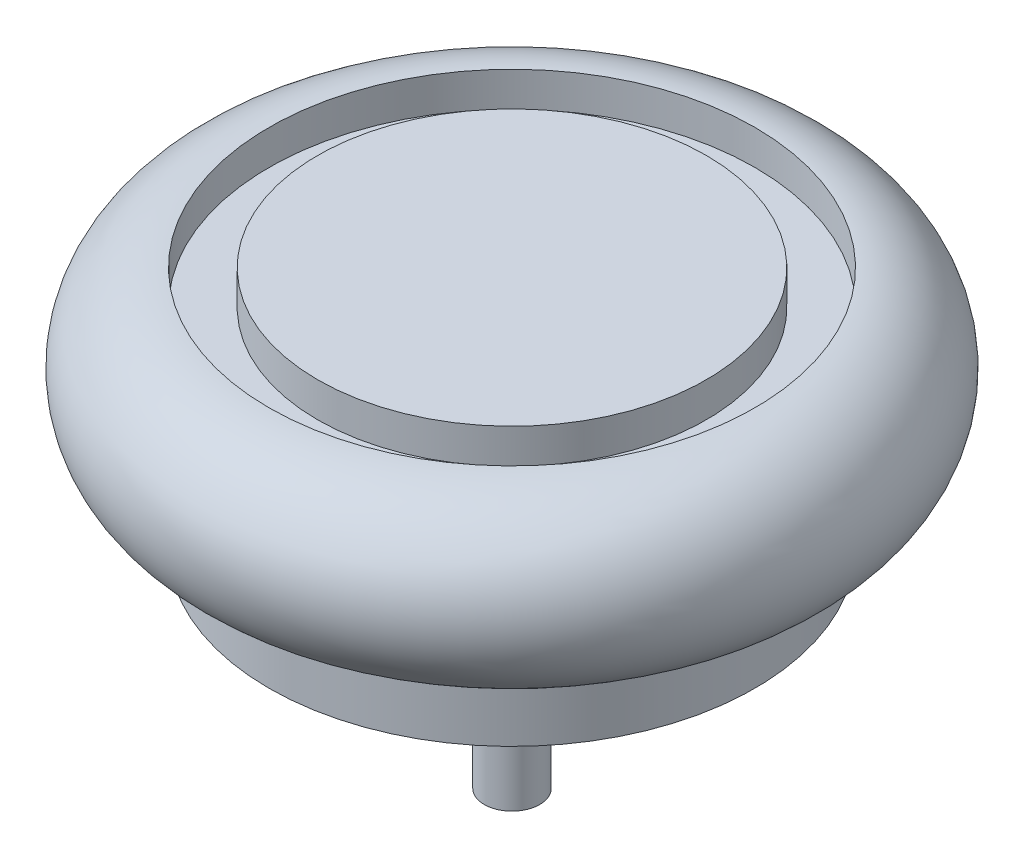
ISO-10303-21;
HEADER;
FILE_DESCRIPTION(('STEP AP214'),'2;1');
FILE_NAME('part.step','',(''),(''),'','','');
FILE_SCHEMA(('AUTOMOTIVE_DESIGN { 1 0 10303 214 1 1 1 1 }'));
ENDSEC;
DATA;
#1=APPLICATION_CONTEXT('core data for automotive mechanical design processes');
#2=APPLICATION_PROTOCOL_DEFINITION('international standard','automotive_design',2000,#1);
#3=PRODUCT_CONTEXT('',#1,'mechanical');
#4=PRODUCT('Part','Part','',(#3));
#5=PRODUCT_RELATED_PRODUCT_CATEGORY('part','',(#4));
#6=PRODUCT_DEFINITION_FORMATION('','',#4);
#7=PRODUCT_DEFINITION_CONTEXT('part definition',#1,'design');
#8=PRODUCT_DEFINITION('design','',#6,#7);
#9=PRODUCT_DEFINITION_SHAPE('','',#8);
#10=(LENGTH_UNIT() NAMED_UNIT(*) SI_UNIT(.MILLI.,.METRE.));
#11=(NAMED_UNIT(*) PLANE_ANGLE_UNIT() SI_UNIT($,.RADIAN.));
#12=(NAMED_UNIT(*) SI_UNIT($,.STERADIAN.) SOLID_ANGLE_UNIT());
#13=UNCERTAINTY_MEASURE_WITH_UNIT(LENGTH_MEASURE(1.E-05),#10,'distance_accuracy_value','');
#14=(GEOMETRIC_REPRESENTATION_CONTEXT(3) GLOBAL_UNCERTAINTY_ASSIGNED_CONTEXT((#13)) GLOBAL_UNIT_ASSIGNED_CONTEXT((#10,
#11,#12)) REPRESENTATION_CONTEXT('',''));
#15=CARTESIAN_POINT('',(0.,0.,0.));
#16=DIRECTION('',(0.,0.,1.));
#17=DIRECTION('',(1.,0.,0.));
#18=AXIS2_PLACEMENT_3D('',#15,#16,#17);
#19=CARTESIAN_POINT('',(0.,50.,56.));
#20=DIRECTION('',(0.,1.,0.));
#21=DIRECTION('',(0.,0.,1.));
#22=AXIS2_PLACEMENT_3D('',#19,#20,#21);
#23=PLANE('',#22);
#24=CARTESIAN_POINT('',(0.,50.,0.));
#25=DIRECTION('',(0.,1.,0.));
#26=DIRECTION('',(0.,0.,1.));
#27=AXIS2_PLACEMENT_3D('',#24,#25,#26);
#28=CIRCLE('',#27,56.);
#29=CARTESIAN_POINT('',(0.,50.,56.));
#30=VERTEX_POINT('',#29);
#31=EDGE_CURVE('E43',#30,#30,#28,.T.);
#32=ORIENTED_EDGE('',*,*,#31,.T.);
#33=EDGE_LOOP('',(#32));
#34=FACE_BOUND('',#33,.T.);
#35=ADVANCED_FACE('F40',(#34),#23,.T.);
#36=CARTESIAN_POINT('',(0.,50.,0.));
#37=DIRECTION('',(0.,1.,0.));
#38=DIRECTION('',(0.,0.,1.));
#39=AXIS2_PLACEMENT_3D('',#36,#37,#38);
#40=CYLINDRICAL_SURFACE('',#39,56.);
#41=CARTESIAN_POINT('',(0.,40.,0.));
#42=DIRECTION('',(0.,1.,0.));
#43=DIRECTION('',(0.,0.,1.));
#44=AXIS2_PLACEMENT_3D('',#41,#42,#43);
#45=CIRCLE('',#44,56.);
#46=CARTESIAN_POINT('',(0.,40.,56.));
#47=VERTEX_POINT('',#46);
#48=EDGE_CURVE('E50',#47,#47,#45,.T.);
#49=ORIENTED_EDGE('',*,*,#48,.T.);
#50=EDGE_LOOP('',(#49));
#51=FACE_BOUND('',#50,.T.);
#52=ORIENTED_EDGE('',*,*,#31,.F.);
#53=EDGE_LOOP('',(#52));
#54=FACE_BOUND('',#53,.T.);
#55=ADVANCED_FACE('F100',(#51,#54),#40,.T.);
#56=CARTESIAN_POINT('',(0.,40.,70.));
#57=DIRECTION('',(0.,1.,0.));
#58=DIRECTION('',(0.,0.,1.));
#59=AXIS2_PLACEMENT_3D('',#56,#57,#58);
#60=PLANE('',#59);
#61=CARTESIAN_POINT('',(0.,40.,0.));
#62=DIRECTION('',(0.,1.,0.));
#63=DIRECTION('',(0.,0.,1.));
#64=AXIS2_PLACEMENT_3D('',#61,#62,#63);
#65=CIRCLE('',#64,70.);
#66=CARTESIAN_POINT('',(0.,40.,70.));
#67=VERTEX_POINT('',#66);
#68=EDGE_CURVE('E51',#67,#67,#65,.T.);
#69=ORIENTED_EDGE('',*,*,#68,.T.);
#70=EDGE_LOOP('',(#69));
#71=FACE_BOUND('',#70,.T.);
#72=ORIENTED_EDGE('',*,*,#48,.F.);
#73=EDGE_LOOP('',(#72));
#74=FACE_BOUND('',#73,.T.);
#75=ADVANCED_FACE('F101',(#71,#74),#60,.T.);
#76=CARTESIAN_POINT('',(0.,50.,0.));
#77=DIRECTION('',(0.,1.,0.));
#78=DIRECTION('',(0.,0.,1.));
#79=AXIS2_PLACEMENT_3D('',#76,#77,#78);
#80=CYLINDRICAL_SURFACE('',#79,70.);
#81=CARTESIAN_POINT('',(0.,50.,0.));
#82=DIRECTION('',(0.,1.,0.));
#83=DIRECTION('',(0.,0.,1.));
#84=AXIS2_PLACEMENT_3D('',#81,#82,#83);
#85=CIRCLE('',#84,70.);
#86=CARTESIAN_POINT('',(0.,50.,70.));
#87=VERTEX_POINT('',#86);
#88=EDGE_CURVE('E57',#87,#87,#85,.T.);
#89=ORIENTED_EDGE('',*,*,#88,.T.);
#90=EDGE_LOOP('',(#89));
#91=FACE_BOUND('',#90,.T.);
#92=ORIENTED_EDGE('',*,*,#68,.F.);
#93=EDGE_LOOP('',(#92));
#94=FACE_BOUND('',#93,.T.);
#95=ADVANCED_FACE('F106',(#91,#94),#80,.F.);
#96=CARTESIAN_POINT('',(0.,25.,0.));
#97=DIRECTION('',(0.,1.,0.));
#98=DIRECTION('',(0.,0.,1.));
#99=AXIS2_PLACEMENT_3D('',#96,#97,#98);
#100=TOROIDAL_SURFACE('',#99,70.,25.);
#101=CARTESIAN_POINT('',(0.,0.,0.));
#102=DIRECTION('',(0.,-1.,0.));
#103=DIRECTION('',(0.,0.,-1.));
#104=AXIS2_PLACEMENT_3D('',#101,#102,#103);
#105=CIRCLE('',#104,70.);
#106=CARTESIAN_POINT('',(0.,0.,-70.));
#107=VERTEX_POINT('',#106);
#108=EDGE_CURVE('E58',#107,#107,#105,.T.);
#109=ORIENTED_EDGE('',*,*,#108,.F.);
#110=EDGE_LOOP('',(#109));
#111=FACE_BOUND('',#110,.T.);
#112=ORIENTED_EDGE('',*,*,#88,.F.);
#113=EDGE_LOOP('',(#112));
#114=FACE_BOUND('',#113,.T.);
#115=ADVANCED_FACE('F115',(#111,#114),#100,.T.);
#116=CARTESIAN_POINT('',(0.,-20.,0.));
#117=DIRECTION('',(0.,-1.,0.));
#118=DIRECTION('',(0.,0.,-1.));
#119=AXIS2_PLACEMENT_3D('',#116,#117,#118);
#120=PLANE('',#119);
#121=CARTESIAN_POINT('',(0.,-20.,0.));
#122=DIRECTION('',(0.,-1.,0.));
#123=DIRECTION('',(0.,0.,-1.));
#124=AXIS2_PLACEMENT_3D('',#121,#122,#123);
#125=CIRCLE('',#124,70.);
#126=CARTESIAN_POINT('',(0.,-20.,-70.));
#127=VERTEX_POINT('',#126);
#128=EDGE_CURVE('E56',#127,#127,#125,.T.);
#129=ORIENTED_EDGE('',*,*,#128,.T.);
#130=EDGE_LOOP('',(#129));
#131=FACE_BOUND('',#130,.T.);
#132=CARTESIAN_POINT('',(0.,-20.,0.));
#133=DIRECTION('',(0.,-1.,0.));
#134=DIRECTION('',(0.,0.,-1.));
#135=AXIS2_PLACEMENT_3D('',#132,#133,#134);
#136=CIRCLE('',#135,40.);
#137=CARTESIAN_POINT('',(0.,-20.,-40.));
#138=VERTEX_POINT('',#137);
#139=EDGE_CURVE('E62',#138,#138,#136,.T.);
#140=ORIENTED_EDGE('',*,*,#139,.F.);
#141=EDGE_LOOP('',(#140));
#142=FACE_BOUND('',#141,.T.);
#143=ADVANCED_FACE('F113',(#131,#142),#120,.T.);
#144=CARTESIAN_POINT('',(0.,-20.,0.));
#145=DIRECTION('',(0.,1.,0.));
#146=DIRECTION('',(0.,0.,1.));
#147=AXIS2_PLACEMENT_3D('',#144,#145,#146);
#148=CYLINDRICAL_SURFACE('',#147,70.);
#149=ORIENTED_EDGE('',*,*,#128,.F.);
#150=EDGE_LOOP('',(#149));
#151=FACE_BOUND('',#150,.T.);
#152=ORIENTED_EDGE('',*,*,#108,.T.);
#153=EDGE_LOOP('',(#152));
#154=FACE_BOUND('',#153,.T.);
#155=ADVANCED_FACE('F93',(#151,#154),#148,.T.);
#156=CARTESIAN_POINT('',(0.,-20.,0.));
#157=DIRECTION('',(0.,1.,0.));
#158=DIRECTION('',(0.,0.,1.));
#159=AXIS2_PLACEMENT_3D('',#156,#157,#158);
#160=CYLINDRICAL_SURFACE('',#159,40.);
#161=ORIENTED_EDGE('',*,*,#139,.T.);
#162=EDGE_LOOP('',(#161));
#163=FACE_BOUND('',#162,.T.);
#164=CARTESIAN_POINT('',(0.,0.,0.));
#165=DIRECTION('',(0.,-1.,0.));
#166=DIRECTION('',(0.,0.,-1.));
#167=AXIS2_PLACEMENT_3D('',#164,#165,#166);
#168=CIRCLE('',#167,40.);
#169=CARTESIAN_POINT('',(0.,0.,-40.));
#170=VERTEX_POINT('',#169);
#171=EDGE_CURVE('E10',#170,#170,#168,.F.);
#172=ORIENTED_EDGE('',*,*,#171,.T.);
#173=EDGE_LOOP('',(#172));
#174=FACE_BOUND('',#173,.T.);
#175=ADVANCED_FACE('F88',(#163,#174),#160,.F.);
#176=CARTESIAN_POINT('',(0.,0.,0.));
#177=DIRECTION('',(0.,-1.,0.));
#178=DIRECTION('',(0.,0.,-1.));
#179=AXIS2_PLACEMENT_3D('',#176,#177,#178);
#180=PLANE('',#179);
#181=CARTESIAN_POINT('',(0.,0.,0.));
#182=DIRECTION('',(0.,-1.,0.));
#183=DIRECTION('',(0.,0.,-1.));
#184=AXIS2_PLACEMENT_3D('',#181,#182,#183);
#185=CIRCLE('',#184,8.);
#186=CARTESIAN_POINT('',(0.,0.,-8.));
#187=VERTEX_POINT('',#186);
#188=EDGE_CURVE('E68',#187,#187,#185,.T.);
#189=ORIENTED_EDGE('',*,*,#188,.F.);
#190=EDGE_LOOP('',(#189));
#191=FACE_BOUND('',#190,.T.);
#192=ORIENTED_EDGE('',*,*,#171,.F.);
#193=EDGE_LOOP('',(#192));
#194=FACE_BOUND('',#193,.T.);
#195=ADVANCED_FACE('F79',(#191,#194),#180,.T.);
#196=CARTESIAN_POINT('',(0.,-80.,0.));
#197=DIRECTION('',(0.,1.,0.));
#198=DIRECTION('',(0.,0.,1.));
#199=AXIS2_PLACEMENT_3D('',#196,#197,#198);
#200=CYLINDRICAL_SURFACE('',#199,8.);
#201=CARTESIAN_POINT('',(0.,-80.,0.));
#202=DIRECTION('',(0.,-1.,0.));
#203=DIRECTION('',(0.,0.,-1.));
#204=AXIS2_PLACEMENT_3D('',#201,#202,#203);
#205=CIRCLE('',#204,8.);
#206=CARTESIAN_POINT('',(0.,-80.,-8.));
#207=VERTEX_POINT('',#206);
#208=EDGE_CURVE('E70',#207,#207,#205,.T.);
#209=ORIENTED_EDGE('',*,*,#208,.F.);
#210=EDGE_LOOP('',(#209));
#211=FACE_BOUND('',#210,.T.);
#212=ORIENTED_EDGE('',*,*,#188,.T.);
#213=EDGE_LOOP('',(#212));
#214=FACE_BOUND('',#213,.T.);
#215=ADVANCED_FACE('F80',(#211,#214),#200,.T.);
#216=CARTESIAN_POINT('',(0.,-80.,0.));
#217=DIRECTION('',(0.,-1.,0.));
#218=DIRECTION('',(0.,0.,-1.));
#219=AXIS2_PLACEMENT_3D('',#216,#217,#218);
#220=PLANE('',#219);
#221=ORIENTED_EDGE('',*,*,#208,.T.);
#222=EDGE_LOOP('',(#221));
#223=FACE_BOUND('',#222,.T.);
#224=ADVANCED_FACE('F73',(#223),#220,.T.);
#225=CLOSED_SHELL('',(#35,#55,#75,#95,#115,#143,#155,#175,#195,#215,#224));
#226=MANIFOLD_SOLID_BREP('B2',#225);
#227=ADVANCED_BREP_SHAPE_REPRESENTATION('',(#18,#226),#14);
#228=SHAPE_DEFINITION_REPRESENTATION(#9,#227);
ENDSEC;
END-ISO-10303-21;
